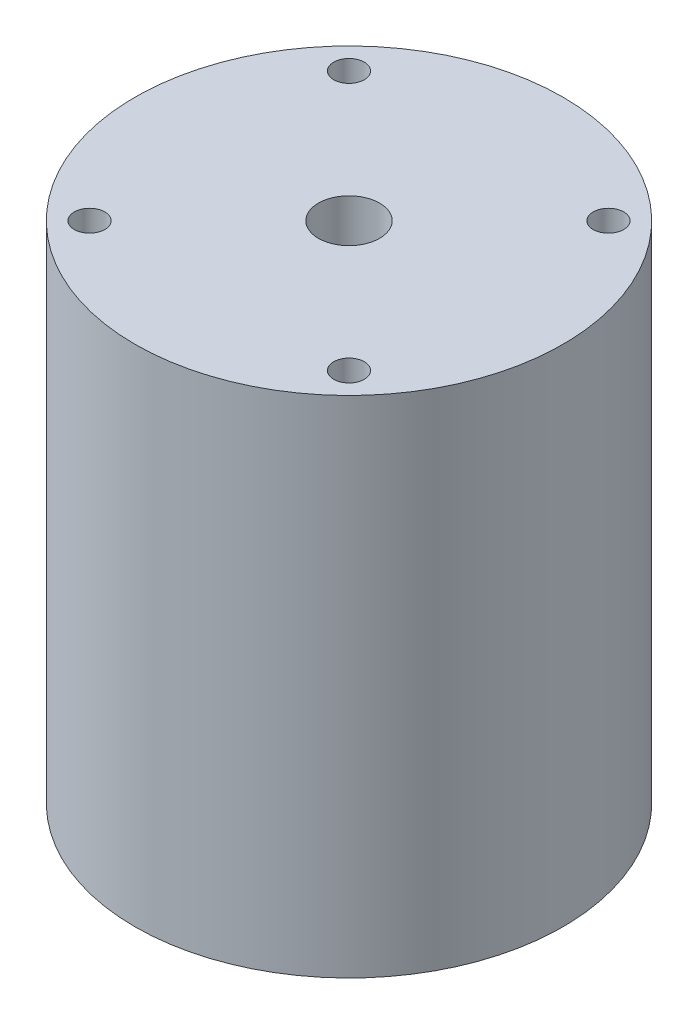
ISO-10303-21;
HEADER;
FILE_DESCRIPTION(('STEP AP214'),'2;1');
FILE_NAME('part.step','',(''),(''),'','','');
FILE_SCHEMA(('AUTOMOTIVE_DESIGN { 1 0 10303 214 1 1 1 1 }'));
ENDSEC;
DATA;
#1=APPLICATION_CONTEXT('core data for automotive mechanical design processes');
#2=APPLICATION_PROTOCOL_DEFINITION('international standard','automotive_design',2000,#1);
#3=PRODUCT_CONTEXT('',#1,'mechanical');
#4=PRODUCT('Part','Part','',(#3));
#5=PRODUCT_RELATED_PRODUCT_CATEGORY('part','',(#4));
#6=PRODUCT_DEFINITION_FORMATION('','',#4);
#7=PRODUCT_DEFINITION_CONTEXT('part definition',#1,'design');
#8=PRODUCT_DEFINITION('design','',#6,#7);
#9=PRODUCT_DEFINITION_SHAPE('','',#8);
#10=(LENGTH_UNIT() NAMED_UNIT(*) SI_UNIT(.MILLI.,.METRE.));
#11=(NAMED_UNIT(*) PLANE_ANGLE_UNIT() SI_UNIT($,.RADIAN.));
#12=(NAMED_UNIT(*) SI_UNIT($,.STERADIAN.) SOLID_ANGLE_UNIT());
#13=UNCERTAINTY_MEASURE_WITH_UNIT(LENGTH_MEASURE(1.E-05),#10,'distance_accuracy_value','');
#14=(GEOMETRIC_REPRESENTATION_CONTEXT(3) GLOBAL_UNCERTAINTY_ASSIGNED_CONTEXT((#13)) GLOBAL_UNIT_ASSIGNED_CONTEXT((#10,
#11,#12)) REPRESENTATION_CONTEXT('',''));
#15=CARTESIAN_POINT('',(0.,0.,0.));
#16=DIRECTION('',(0.,0.,1.));
#17=DIRECTION('',(1.,0.,0.));
#18=AXIS2_PLACEMENT_3D('',#15,#16,#17);
#19=CARTESIAN_POINT('',(0.,66.,0.));
#20=DIRECTION('',(0.,-1.,0.));
#21=DIRECTION('',(0.,0.,-1.));
#22=AXIS2_PLACEMENT_3D('',#19,#20,#21);
#23=CYLINDRICAL_SURFACE('',#22,28.);
#24=CARTESIAN_POINT('',(0.,66.,0.));
#25=DIRECTION('',(0.,1.,0.));
#26=DIRECTION('',(0.,0.,1.));
#27=AXIS2_PLACEMENT_3D('',#24,#25,#26);
#28=CIRCLE('',#27,28.);
#29=CARTESIAN_POINT('',(0.,66.,28.));
#30=VERTEX_POINT('',#29);
#31=EDGE_CURVE('E11',#30,#30,#28,.T.);
#32=ORIENTED_EDGE('',*,*,#31,.F.);
#33=EDGE_LOOP('',(#32));
#34=FACE_BOUND('',#33,.T.);
#35=CARTESIAN_POINT('',(0.,0.,0.));
#36=DIRECTION('',(0.,1.,0.));
#37=DIRECTION('',(0.,0.,1.));
#38=AXIS2_PLACEMENT_3D('',#35,#36,#37);
#39=CIRCLE('',#38,28.);
#40=CARTESIAN_POINT('',(0.,0.,28.));
#41=VERTEX_POINT('',#40);
#42=EDGE_CURVE('E40',#41,#41,#39,.T.);
#43=ORIENTED_EDGE('',*,*,#42,.T.);
#44=EDGE_LOOP('',(#43));
#45=FACE_BOUND('',#44,.T.);
#46=ADVANCED_FACE('F37',(#34,#45),#23,.T.);
#47=CARTESIAN_POINT('',(0.,66.,0.));
#48=DIRECTION('',(0.,1.,0.));
#49=DIRECTION('',(0.,0.,1.));
#50=AXIS2_PLACEMENT_3D('',#47,#48,#49);
#51=PLANE('',#50);
#52=CARTESIAN_POINT('',(0.,66.,0.));
#53=DIRECTION('',(0.,1.,0.));
#54=DIRECTION('',(0.,0.,1.));
#55=AXIS2_PLACEMENT_3D('',#52,#53,#54);
#56=CIRCLE('',#55,4.);
#57=CARTESIAN_POINT('',(0.,66.,4.));
#58=VERTEX_POINT('',#57);
#59=EDGE_CURVE('E102',#58,#58,#56,.T.);
#60=ORIENTED_EDGE('',*,*,#59,.F.);
#61=EDGE_LOOP('',(#60));
#62=FACE_BOUND('',#61,.T.);
#63=CARTESIAN_POINT('',(-16.9705627484771,66.,-16.9705627484772));
#64=DIRECTION('',(0.,1.,0.));
#65=DIRECTION('',(0.,0.,1.));
#66=AXIS2_PLACEMENT_3D('',#63,#64,#65);
#67=CIRCLE('',#66,2.);
#68=CARTESIAN_POINT('',(-16.9705627484771,66.,-14.9705627484772));
#69=VERTEX_POINT('',#68);
#70=EDGE_CURVE('E106',#69,#69,#67,.T.);
#71=ORIENTED_EDGE('',*,*,#70,.F.);
#72=EDGE_LOOP('',(#71));
#73=FACE_BOUND('',#72,.T.);
#74=CARTESIAN_POINT('',(16.9705627484773,66.,-16.970562748478));
#75=DIRECTION('',(0.,1.,0.));
#76=DIRECTION('',(0.,0.,1.));
#77=AXIS2_PLACEMENT_3D('',#74,#75,#76);
#78=CIRCLE('',#77,2.);
#79=CARTESIAN_POINT('',(16.9705627484773,66.,-14.970562748478));
#80=VERTEX_POINT('',#79);
#81=EDGE_CURVE('E114',#80,#80,#78,.T.);
#82=ORIENTED_EDGE('',*,*,#81,.F.);
#83=EDGE_LOOP('',(#82));
#84=FACE_BOUND('',#83,.T.);
#85=CARTESIAN_POINT('',(16.970562748478,66.,16.9705627484763));
#86=DIRECTION('',(0.,1.,0.));
#87=DIRECTION('',(0.,0.,1.));
#88=AXIS2_PLACEMENT_3D('',#85,#86,#87);
#89=CIRCLE('',#88,2.);
#90=CARTESIAN_POINT('',(16.970562748478,66.,18.9705627484763));
#91=VERTEX_POINT('',#90);
#92=EDGE_CURVE('E120',#91,#91,#89,.T.);
#93=ORIENTED_EDGE('',*,*,#92,.F.);
#94=EDGE_LOOP('',(#93));
#95=FACE_BOUND('',#94,.T.);
#96=CARTESIAN_POINT('',(-16.9705627484763,66.,16.9705627484771));
#97=DIRECTION('',(0.,1.,0.));
#98=DIRECTION('',(0.,0.,1.));
#99=AXIS2_PLACEMENT_3D('',#96,#97,#98);
#100=CIRCLE('',#99,2.);
#101=CARTESIAN_POINT('',(-16.9705627484763,66.,18.9705627484771));
#102=VERTEX_POINT('',#101);
#103=EDGE_CURVE('E126',#102,#102,#100,.T.);
#104=ORIENTED_EDGE('',*,*,#103,.F.);
#105=EDGE_LOOP('',(#104));
#106=FACE_BOUND('',#105,.T.);
#107=ORIENTED_EDGE('',*,*,#31,.T.);
#108=EDGE_LOOP('',(#107));
#109=FACE_BOUND('',#108,.T.);
#110=ADVANCED_FACE('F140',(#62,#73,#84,#95,#106,#109),#51,.T.);
#111=CARTESIAN_POINT('',(0.,0.,0.));
#112=DIRECTION('',(0.,1.,0.));
#113=DIRECTION('',(0.,0.,1.));
#114=AXIS2_PLACEMENT_3D('',#111,#112,#113);
#115=PLANE('',#114);
#116=CARTESIAN_POINT('',(-8.5,0.,20.5));
#117=DIRECTION('',(0.,-1.,0.));
#118=DIRECTION('',(0.,0.,-1.));
#119=AXIS2_PLACEMENT_3D('',#116,#117,#118);
#120=CIRCLE('',#119,1.99999999999999);
#121=CARTESIAN_POINT('',(-8.5,0.,18.5));
#122=VERTEX_POINT('',#121);
#123=EDGE_CURVE('E80',#122,#122,#120,.T.);
#124=ORIENTED_EDGE('',*,*,#123,.F.);
#125=EDGE_LOOP('',(#124));
#126=FACE_BOUND('',#125,.T.);
#127=CARTESIAN_POINT('',(8.5,0.,20.5));
#128=DIRECTION('',(0.,-1.,0.));
#129=DIRECTION('',(0.,0.,-1.));
#130=AXIS2_PLACEMENT_3D('',#127,#128,#129);
#131=CIRCLE('',#130,1.99999999999999);
#132=CARTESIAN_POINT('',(8.5,0.,18.5));
#133=VERTEX_POINT('',#132);
#134=EDGE_CURVE('E79',#133,#133,#131,.T.);
#135=ORIENTED_EDGE('',*,*,#134,.F.);
#136=EDGE_LOOP('',(#135));
#137=FACE_BOUND('',#136,.T.);
#138=CARTESIAN_POINT('',(8.5,0.,-20.5));
#139=DIRECTION('',(0.,-1.,0.));
#140=DIRECTION('',(0.,0.,-1.));
#141=AXIS2_PLACEMENT_3D('',#138,#139,#140);
#142=CIRCLE('',#141,1.99999999999999);
#143=CARTESIAN_POINT('',(8.5,0.,-22.5));
#144=VERTEX_POINT('',#143);
#145=EDGE_CURVE('E90',#144,#144,#142,.T.);
#146=ORIENTED_EDGE('',*,*,#145,.F.);
#147=EDGE_LOOP('',(#146));
#148=FACE_BOUND('',#147,.T.);
#149=CARTESIAN_POINT('',(-8.5,0.,-20.5));
#150=DIRECTION('',(0.,-1.,0.));
#151=DIRECTION('',(0.,0.,-1.));
#152=AXIS2_PLACEMENT_3D('',#149,#150,#151);
#153=CIRCLE('',#152,1.99999999999999);
#154=CARTESIAN_POINT('',(-8.5,0.,-22.5));
#155=VERTEX_POINT('',#154);
#156=EDGE_CURVE('E96',#155,#155,#153,.T.);
#157=ORIENTED_EDGE('',*,*,#156,.F.);
#158=EDGE_LOOP('',(#157));
#159=FACE_BOUND('',#158,.T.);
#160=CARTESIAN_POINT('',(0.,0.,0.));
#161=DIRECTION('',(0.,1.,0.));
#162=DIRECTION('',(0.,0.,1.));
#163=AXIS2_PLACEMENT_3D('',#160,#161,#162);
#164=CIRCLE('',#163,4.);
#165=CARTESIAN_POINT('',(0.,0.,4.));
#166=VERTEX_POINT('',#165);
#167=EDGE_CURVE('E103',#166,#166,#164,.T.);
#168=ORIENTED_EDGE('',*,*,#167,.T.);
#169=EDGE_LOOP('',(#168));
#170=FACE_BOUND('',#169,.T.);
#171=ORIENTED_EDGE('',*,*,#42,.F.);
#172=EDGE_LOOP('',(#171));
#173=FACE_BOUND('',#172,.T.);
#174=ADVANCED_FACE('F137',(#126,#137,#148,#159,#170,#173),#115,.F.);
#175=CARTESIAN_POINT('',(-16.9705627484763,51.,16.9705627484771));
#176=DIRECTION('',(0.,1.,0.));
#177=DIRECTION('',(0.,0.,1.));
#178=AXIS2_PLACEMENT_3D('',#175,#176,#177);
#179=CONICAL_SURFACE('',#178,2.,1.02974425867665);
#180=CARTESIAN_POINT('',(-16.9705627484763,49.7982787619449,16.9705627484771));
#181=VERTEX_POINT('',#180);
#182=VERTEX_LOOP('',#181);
#183=FACE_BOUND('',#182,.T.);
#184=CARTESIAN_POINT('',(-16.9705627484763,51.,16.9705627484771));
#185=DIRECTION('',(0.,1.,0.));
#186=DIRECTION('',(0.,0.,1.));
#187=AXIS2_PLACEMENT_3D('',#184,#185,#186);
#188=CIRCLE('',#187,2.);
#189=CARTESIAN_POINT('',(-16.9705627484763,51.,18.9705627484771));
#190=VERTEX_POINT('',#189);
#191=EDGE_CURVE('E129',#190,#190,#188,.T.);
#192=ORIENTED_EDGE('',*,*,#191,.T.);
#193=EDGE_LOOP('',(#192));
#194=FACE_BOUND('',#193,.T.);
#195=ADVANCED_FACE('F139',(#183,#194),#179,.F.);
#196=CARTESIAN_POINT('',(-16.9705627484763,66.,16.9705627484771));
#197=DIRECTION('',(0.,1.,0.));
#198=DIRECTION('',(0.,0.,1.));
#199=AXIS2_PLACEMENT_3D('',#196,#197,#198);
#200=CYLINDRICAL_SURFACE('',#199,2.);
#201=ORIENTED_EDGE('',*,*,#191,.F.);
#202=EDGE_LOOP('',(#201));
#203=FACE_BOUND('',#202,.T.);
#204=ORIENTED_EDGE('',*,*,#103,.T.);
#205=EDGE_LOOP('',(#204));
#206=FACE_BOUND('',#205,.T.);
#207=ADVANCED_FACE('F146',(#203,#206),#200,.F.);
#208=CARTESIAN_POINT('',(16.970562748478,51.,16.9705627484763));
#209=DIRECTION('',(0.,1.,0.));
#210=DIRECTION('',(0.,0.,1.));
#211=AXIS2_PLACEMENT_3D('',#208,#209,#210);
#212=CONICAL_SURFACE('',#211,2.,1.02974425867665);
#213=CARTESIAN_POINT('',(16.970562748478,49.7982787619449,16.9705627484763));
#214=VERTEX_POINT('',#213);
#215=VERTEX_LOOP('',#214);
#216=FACE_BOUND('',#215,.T.);
#217=CARTESIAN_POINT('',(16.970562748478,51.,16.9705627484763));
#218=DIRECTION('',(0.,1.,0.));
#219=DIRECTION('',(0.,0.,1.));
#220=AXIS2_PLACEMENT_3D('',#217,#218,#219);
#221=CIRCLE('',#220,2.);
#222=CARTESIAN_POINT('',(16.970562748478,51.,18.9705627484763));
#223=VERTEX_POINT('',#222);
#224=EDGE_CURVE('E123',#223,#223,#221,.T.);
#225=ORIENTED_EDGE('',*,*,#224,.T.);
#226=EDGE_LOOP('',(#225));
#227=FACE_BOUND('',#226,.T.);
#228=ADVANCED_FACE('F280',(#216,#227),#212,.F.);
#229=CARTESIAN_POINT('',(16.970562748478,66.,16.9705627484763));
#230=DIRECTION('',(0.,1.,0.));
#231=DIRECTION('',(0.,0.,1.));
#232=AXIS2_PLACEMENT_3D('',#229,#230,#231);
#233=CYLINDRICAL_SURFACE('',#232,2.);
#234=ORIENTED_EDGE('',*,*,#224,.F.);
#235=EDGE_LOOP('',(#234));
#236=FACE_BOUND('',#235,.T.);
#237=ORIENTED_EDGE('',*,*,#92,.T.);
#238=EDGE_LOOP('',(#237));
#239=FACE_BOUND('',#238,.T.);
#240=ADVANCED_FACE('F276',(#236,#239),#233,.F.);
#241=CARTESIAN_POINT('',(16.9705627484773,51.,-16.970562748478));
#242=DIRECTION('',(0.,1.,0.));
#243=DIRECTION('',(0.,0.,1.));
#244=AXIS2_PLACEMENT_3D('',#241,#242,#243);
#245=CONICAL_SURFACE('',#244,2.,1.02974425867665);
#246=CARTESIAN_POINT('',(16.9705627484773,49.7982787619449,-16.970562748478));
#247=VERTEX_POINT('',#246);
#248=VERTEX_LOOP('',#247);
#249=FACE_BOUND('',#248,.T.);
#250=CARTESIAN_POINT('',(16.9705627484773,51.,-16.970562748478));
#251=DIRECTION('',(0.,1.,0.));
#252=DIRECTION('',(0.,0.,1.));
#253=AXIS2_PLACEMENT_3D('',#250,#251,#252);
#254=CIRCLE('',#253,2.);
#255=CARTESIAN_POINT('',(16.9705627484773,51.,-14.970562748478));
#256=VERTEX_POINT('',#255);
#257=EDGE_CURVE('E117',#256,#256,#254,.T.);
#258=ORIENTED_EDGE('',*,*,#257,.T.);
#259=EDGE_LOOP('',(#258));
#260=FACE_BOUND('',#259,.T.);
#261=ADVANCED_FACE('F272',(#249,#260),#245,.F.);
#262=CARTESIAN_POINT('',(16.9705627484773,66.,-16.970562748478));
#263=DIRECTION('',(0.,1.,0.));
#264=DIRECTION('',(0.,0.,1.));
#265=AXIS2_PLACEMENT_3D('',#262,#263,#264);
#266=CYLINDRICAL_SURFACE('',#265,2.);
#267=ORIENTED_EDGE('',*,*,#257,.F.);
#268=EDGE_LOOP('',(#267));
#269=FACE_BOUND('',#268,.T.);
#270=ORIENTED_EDGE('',*,*,#81,.T.);
#271=EDGE_LOOP('',(#270));
#272=FACE_BOUND('',#271,.T.);
#273=ADVANCED_FACE('F268',(#269,#272),#266,.F.);
#274=CARTESIAN_POINT('',(-16.9705627484771,51.,-16.9705627484772));
#275=DIRECTION('',(0.,1.,0.));
#276=DIRECTION('',(0.,0.,1.));
#277=AXIS2_PLACEMENT_3D('',#274,#275,#276);
#278=CONICAL_SURFACE('',#277,2.,1.02974425867665);
#279=CARTESIAN_POINT('',(-16.9705627484771,49.7982787619449,-16.9705627484772));
#280=VERTEX_POINT('',#279);
#281=VERTEX_LOOP('',#280);
#282=FACE_BOUND('',#281,.T.);
#283=CARTESIAN_POINT('',(-16.9705627484771,51.,-16.9705627484772));
#284=DIRECTION('',(0.,1.,0.));
#285=DIRECTION('',(0.,0.,1.));
#286=AXIS2_PLACEMENT_3D('',#283,#284,#285);
#287=CIRCLE('',#286,2.);
#288=CARTESIAN_POINT('',(-16.9705627484771,51.,-14.9705627484772));
#289=VERTEX_POINT('',#288);
#290=EDGE_CURVE('E111',#289,#289,#287,.T.);
#291=ORIENTED_EDGE('',*,*,#290,.T.);
#292=EDGE_LOOP('',(#291));
#293=FACE_BOUND('',#292,.T.);
#294=ADVANCED_FACE('F264',(#282,#293),#278,.F.);
#295=CARTESIAN_POINT('',(-16.9705627484771,66.,-16.9705627484772));
#296=DIRECTION('',(0.,1.,0.));
#297=DIRECTION('',(0.,0.,1.));
#298=AXIS2_PLACEMENT_3D('',#295,#296,#297);
#299=CYLINDRICAL_SURFACE('',#298,2.);
#300=ORIENTED_EDGE('',*,*,#290,.F.);
#301=EDGE_LOOP('',(#300));
#302=FACE_BOUND('',#301,.T.);
#303=ORIENTED_EDGE('',*,*,#70,.T.);
#304=EDGE_LOOP('',(#303));
#305=FACE_BOUND('',#304,.T.);
#306=ADVANCED_FACE('F170',(#302,#305),#299,.F.);
#307=CARTESIAN_POINT('',(0.,0.,0.));
#308=DIRECTION('',(0.,1.,0.));
#309=DIRECTION('',(0.,0.,1.));
#310=AXIS2_PLACEMENT_3D('',#307,#308,#309);
#311=CYLINDRICAL_SURFACE('',#310,4.);
#312=ORIENTED_EDGE('',*,*,#167,.F.);
#313=EDGE_LOOP('',(#312));
#314=FACE_BOUND('',#313,.T.);
#315=ORIENTED_EDGE('',*,*,#59,.T.);
#316=EDGE_LOOP('',(#315));
#317=FACE_BOUND('',#316,.T.);
#318=ADVANCED_FACE('F175',(#314,#317),#311,.F.);
#319=CARTESIAN_POINT('',(-8.5,15.,-20.5));
#320=DIRECTION('',(0.,-1.,0.));
#321=DIRECTION('',(0.,0.,-1.));
#322=AXIS2_PLACEMENT_3D('',#319,#320,#321);
#323=CONICAL_SURFACE('',#322,2.,1.02974425867665);
#324=CARTESIAN_POINT('',(-8.5,16.2017212380551,-20.5));
#325=VERTEX_POINT('',#324);
#326=VERTEX_LOOP('',#325);
#327=FACE_BOUND('',#326,.T.);
#328=CARTESIAN_POINT('',(-8.5,15.,-20.5));
#329=DIRECTION('',(0.,-1.,0.));
#330=DIRECTION('',(0.,0.,-1.));
#331=AXIS2_PLACEMENT_3D('',#328,#329,#330);
#332=CIRCLE('',#331,2.);
#333=CARTESIAN_POINT('',(-8.5,15.,-22.5));
#334=VERTEX_POINT('',#333);
#335=EDGE_CURVE('E99',#334,#334,#332,.T.);
#336=ORIENTED_EDGE('',*,*,#335,.T.);
#337=EDGE_LOOP('',(#336));
#338=FACE_BOUND('',#337,.T.);
#339=ADVANCED_FACE('F179',(#327,#338),#323,.F.);
#340=CARTESIAN_POINT('',(-8.5,0.,-20.5));
#341=DIRECTION('',(0.,-1.,0.));
#342=DIRECTION('',(0.,0.,-1.));
#343=AXIS2_PLACEMENT_3D('',#340,#341,#342);
#344=CYLINDRICAL_SURFACE('',#343,1.99999999999999);
#345=ORIENTED_EDGE('',*,*,#335,.F.);
#346=EDGE_LOOP('',(#345));
#347=FACE_BOUND('',#346,.T.);
#348=ORIENTED_EDGE('',*,*,#156,.T.);
#349=EDGE_LOOP('',(#348));
#350=FACE_BOUND('',#349,.T.);
#351=ADVANCED_FACE('F194',(#347,#350),#344,.F.);
#352=CARTESIAN_POINT('',(8.5,15.,-20.5));
#353=DIRECTION('',(0.,-1.,0.));
#354=DIRECTION('',(0.,0.,-1.));
#355=AXIS2_PLACEMENT_3D('',#352,#353,#354);
#356=CONICAL_SURFACE('',#355,2.,1.02974425867665);
#357=CARTESIAN_POINT('',(8.5,16.2017212380551,-20.5));
#358=VERTEX_POINT('',#357);
#359=VERTEX_LOOP('',#358);
#360=FACE_BOUND('',#359,.T.);
#361=CARTESIAN_POINT('',(8.5,15.,-20.5));
#362=DIRECTION('',(0.,-1.,0.));
#363=DIRECTION('',(0.,0.,-1.));
#364=AXIS2_PLACEMENT_3D('',#361,#362,#363);
#365=CIRCLE('',#364,2.);
#366=CARTESIAN_POINT('',(8.5,15.,-22.5));
#367=VERTEX_POINT('',#366);
#368=EDGE_CURVE('E93',#367,#367,#365,.T.);
#369=ORIENTED_EDGE('',*,*,#368,.T.);
#370=EDGE_LOOP('',(#369));
#371=FACE_BOUND('',#370,.T.);
#372=ADVANCED_FACE('F204',(#360,#371),#356,.F.);
#373=CARTESIAN_POINT('',(8.5,0.,-20.5));
#374=DIRECTION('',(0.,-1.,0.));
#375=DIRECTION('',(0.,0.,-1.));
#376=AXIS2_PLACEMENT_3D('',#373,#374,#375);
#377=CYLINDRICAL_SURFACE('',#376,1.99999999999999);
#378=ORIENTED_EDGE('',*,*,#368,.F.);
#379=EDGE_LOOP('',(#378));
#380=FACE_BOUND('',#379,.T.);
#381=ORIENTED_EDGE('',*,*,#145,.T.);
#382=EDGE_LOOP('',(#381));
#383=FACE_BOUND('',#382,.T.);
#384=ADVANCED_FACE('F214',(#380,#383),#377,.F.);
#385=CARTESIAN_POINT('',(8.5,15.,20.5));
#386=DIRECTION('',(0.,-1.,0.));
#387=DIRECTION('',(0.,0.,-1.));
#388=AXIS2_PLACEMENT_3D('',#385,#386,#387);
#389=CONICAL_SURFACE('',#388,2.,1.02974425867665);
#390=CARTESIAN_POINT('',(8.5,16.2017212380551,20.5));
#391=VERTEX_POINT('',#390);
#392=VERTEX_LOOP('',#391);
#393=FACE_BOUND('',#392,.T.);
#394=CARTESIAN_POINT('',(8.5,15.,20.5));
#395=DIRECTION('',(0.,-1.,0.));
#396=DIRECTION('',(0.,0.,-1.));
#397=AXIS2_PLACEMENT_3D('',#394,#395,#396);
#398=CIRCLE('',#397,2.);
#399=CARTESIAN_POINT('',(8.5,15.,18.5));
#400=VERTEX_POINT('',#399);
#401=EDGE_CURVE('E83',#400,#400,#398,.T.);
#402=ORIENTED_EDGE('',*,*,#401,.T.);
#403=EDGE_LOOP('',(#402));
#404=FACE_BOUND('',#403,.T.);
#405=ADVANCED_FACE('F224',(#393,#404),#389,.F.);
#406=CARTESIAN_POINT('',(8.5,0.,20.5));
#407=DIRECTION('',(0.,-1.,0.));
#408=DIRECTION('',(0.,0.,-1.));
#409=AXIS2_PLACEMENT_3D('',#406,#407,#408);
#410=CYLINDRICAL_SURFACE('',#409,1.99999999999999);
#411=ORIENTED_EDGE('',*,*,#401,.F.);
#412=EDGE_LOOP('',(#411));
#413=FACE_BOUND('',#412,.T.);
#414=ORIENTED_EDGE('',*,*,#134,.T.);
#415=EDGE_LOOP('',(#414));
#416=FACE_BOUND('',#415,.T.);
#417=ADVANCED_FACE('F73',(#413,#416),#410,.F.);
#418=CARTESIAN_POINT('',(-8.5,15.,20.5));
#419=DIRECTION('',(0.,-1.,0.));
#420=DIRECTION('',(0.,0.,-1.));
#421=AXIS2_PLACEMENT_3D('',#418,#419,#420);
#422=CONICAL_SURFACE('',#421,2.,1.02974425867665);
#423=CARTESIAN_POINT('',(-8.5,16.2017212380551,20.5));
#424=VERTEX_POINT('',#423);
#425=VERTEX_LOOP('',#424);
#426=FACE_BOUND('',#425,.T.);
#427=CARTESIAN_POINT('',(-8.5,15.,20.5));
#428=DIRECTION('',(0.,-1.,0.));
#429=DIRECTION('',(0.,0.,-1.));
#430=AXIS2_PLACEMENT_3D('',#427,#428,#429);
#431=CIRCLE('',#430,2.);
#432=CARTESIAN_POINT('',(-8.5,15.,18.5));
#433=VERTEX_POINT('',#432);
#434=EDGE_CURVE('E77',#433,#433,#431,.T.);
#435=ORIENTED_EDGE('',*,*,#434,.T.);
#436=EDGE_LOOP('',(#435));
#437=FACE_BOUND('',#436,.T.);
#438=ADVANCED_FACE('F69',(#426,#437),#422,.F.);
#439=CARTESIAN_POINT('',(-8.5,0.,20.5));
#440=DIRECTION('',(0.,-1.,0.));
#441=DIRECTION('',(0.,0.,-1.));
#442=AXIS2_PLACEMENT_3D('',#439,#440,#441);
#443=CYLINDRICAL_SURFACE('',#442,1.99999999999999);
#444=ORIENTED_EDGE('',*,*,#434,.F.);
#445=EDGE_LOOP('',(#444));
#446=FACE_BOUND('',#445,.T.);
#447=ORIENTED_EDGE('',*,*,#123,.T.);
#448=EDGE_LOOP('',(#447));
#449=FACE_BOUND('',#448,.T.);
#450=ADVANCED_FACE('F72',(#446,#449),#443,.F.);
#451=CLOSED_SHELL('',(#46,#110,#174,#195,#207,#228,#240,#261,#273,#294,#306,#318,#339,#351,#372,
#384,#405,#417,#438,#450));
#452=MANIFOLD_SOLID_BREP('B2',#451);
#453=ADVANCED_BREP_SHAPE_REPRESENTATION('',(#18,#452),#14);
#454=SHAPE_DEFINITION_REPRESENTATION(#9,#453);
ENDSEC;
END-ISO-10303-21;
